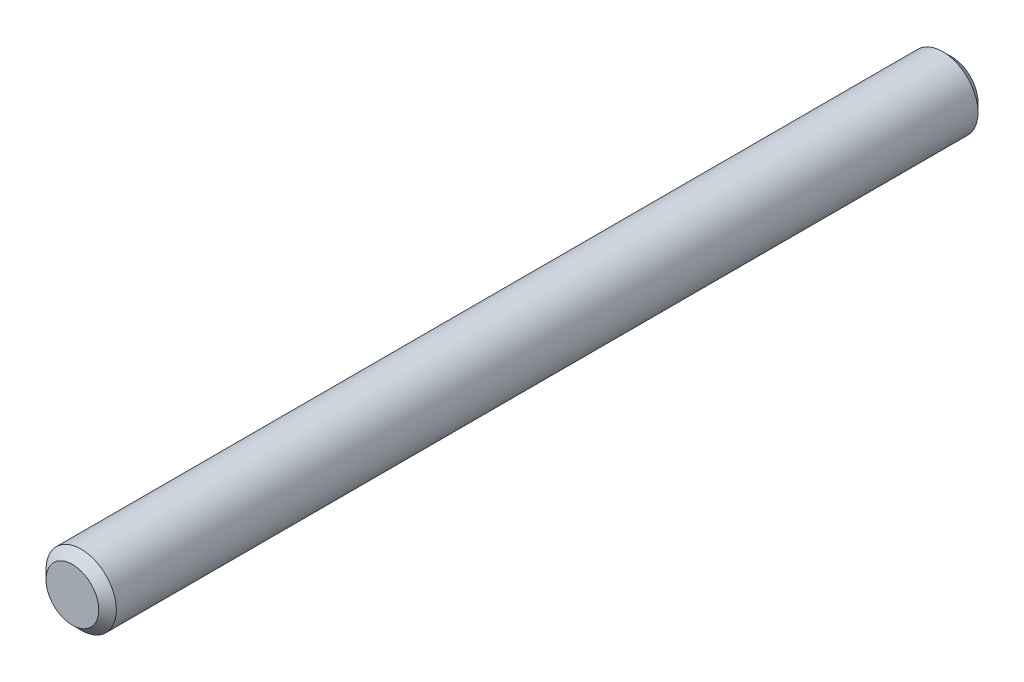
ISO-10303-21;
HEADER;
FILE_DESCRIPTION(('STEP AP214'),'2;1');
FILE_NAME('part.step','',(''),(''),'','','');
FILE_SCHEMA(('AUTOMOTIVE_DESIGN { 1 0 10303 214 1 1 1 1 }'));
ENDSEC;
DATA;
#1=APPLICATION_CONTEXT('core data for automotive mechanical design processes');
#2=APPLICATION_PROTOCOL_DEFINITION('international standard','automotive_design',2000,#1);
#3=PRODUCT_CONTEXT('',#1,'mechanical');
#4=PRODUCT('Part','Part','',(#3));
#5=PRODUCT_RELATED_PRODUCT_CATEGORY('part','',(#4));
#6=PRODUCT_DEFINITION_FORMATION('','',#4);
#7=PRODUCT_DEFINITION_CONTEXT('part definition',#1,'design');
#8=PRODUCT_DEFINITION('design','',#6,#7);
#9=PRODUCT_DEFINITION_SHAPE('','',#8);
#10=(LENGTH_UNIT() NAMED_UNIT(*) SI_UNIT(.MILLI.,.METRE.));
#11=(NAMED_UNIT(*) PLANE_ANGLE_UNIT() SI_UNIT($,.RADIAN.));
#12=(NAMED_UNIT(*) SI_UNIT($,.STERADIAN.) SOLID_ANGLE_UNIT());
#13=UNCERTAINTY_MEASURE_WITH_UNIT(LENGTH_MEASURE(1.E-05),#10,'distance_accuracy_value','');
#14=(GEOMETRIC_REPRESENTATION_CONTEXT(3) GLOBAL_UNCERTAINTY_ASSIGNED_CONTEXT((#13)) GLOBAL_UNIT_ASSIGNED_CONTEXT((#10,
#11,#12)) REPRESENTATION_CONTEXT('',''));
#15=CARTESIAN_POINT('',(0.,0.,0.));
#16=DIRECTION('',(0.,0.,1.));
#17=DIRECTION('',(1.,0.,0.));
#18=AXIS2_PLACEMENT_3D('',#15,#16,#17);
#19=CARTESIAN_POINT('',(0.,0.,100.));
#20=DIRECTION('',(0.,0.,-1.));
#21=DIRECTION('',(-1.,0.,0.));
#22=AXIS2_PLACEMENT_3D('',#19,#20,#21);
#23=CYLINDRICAL_SURFACE('',#22,4.);
#24=CARTESIAN_POINT('',(0.,0.,99.));
#25=DIRECTION('',(0.,0.,1.));
#26=DIRECTION('',(1.,0.,0.));
#27=AXIS2_PLACEMENT_3D('',#24,#25,#26);
#28=CIRCLE('',#27,4.);
#29=CARTESIAN_POINT('',(4.,0.,99.));
#30=VERTEX_POINT('',#29);
#31=EDGE_CURVE('E37',#30,#30,#28,.F.);
#32=ORIENTED_EDGE('',*,*,#31,.T.);
#33=EDGE_LOOP('',(#32));
#34=FACE_BOUND('',#33,.T.);
#35=CARTESIAN_POINT('',(0.,0.,0.999999999999987));
#36=DIRECTION('',(0.,0.,1.));
#37=DIRECTION('',(1.,0.,0.));
#38=AXIS2_PLACEMENT_3D('',#35,#36,#37);
#39=CIRCLE('',#38,4.);
#40=CARTESIAN_POINT('',(4.,0.,0.999999999999987));
#41=VERTEX_POINT('',#40);
#42=EDGE_CURVE('E41',#41,#41,#39,.T.);
#43=ORIENTED_EDGE('',*,*,#42,.T.);
#44=EDGE_LOOP('',(#43));
#45=FACE_BOUND('',#44,.T.);
#46=ADVANCED_FACE('F30',(#34,#45),#23,.T.);
#47=CARTESIAN_POINT('',(0.,0.,100.));
#48=DIRECTION('',(0.,0.,1.));
#49=DIRECTION('',(1.,0.,0.));
#50=AXIS2_PLACEMENT_3D('',#47,#48,#49);
#51=PLANE('',#50);
#52=CARTESIAN_POINT('',(0.,0.,100.));
#53=DIRECTION('',(0.,0.,1.));
#54=DIRECTION('',(1.,0.,0.));
#55=AXIS2_PLACEMENT_3D('',#52,#53,#54);
#56=CIRCLE('',#55,3.00000000000002);
#57=CARTESIAN_POINT('',(3.00000000000002,0.,100.));
#58=VERTEX_POINT('',#57);
#59=EDGE_CURVE('E45',#58,#58,#56,.T.);
#60=ORIENTED_EDGE('',*,*,#59,.T.);
#61=EDGE_LOOP('',(#60));
#62=FACE_BOUND('',#61,.T.);
#63=ADVANCED_FACE('F51',(#62),#51,.T.);
#64=CARTESIAN_POINT('',(0.,0.,0.));
#65=DIRECTION('',(0.,0.,1.));
#66=DIRECTION('',(1.,0.,0.));
#67=AXIS2_PLACEMENT_3D('',#64,#65,#66);
#68=PLANE('',#67);
#69=CARTESIAN_POINT('',(0.,0.,0.));
#70=DIRECTION('',(0.,0.,1.));
#71=DIRECTION('',(1.,0.,0.));
#72=AXIS2_PLACEMENT_3D('',#69,#70,#71);
#73=CIRCLE('',#72,3.00000000000002);
#74=CARTESIAN_POINT('',(3.00000000000002,0.,0.));
#75=VERTEX_POINT('',#74);
#76=EDGE_CURVE('E10',#75,#75,#73,.F.);
#77=ORIENTED_EDGE('',*,*,#76,.T.);
#78=EDGE_LOOP('',(#77));
#79=FACE_BOUND('',#78,.T.);
#80=ADVANCED_FACE('F55',(#79),#68,.F.);
#81=CARTESIAN_POINT('',(0.,0.,100.));
#82=DIRECTION('',(0.,0.,-1.));
#83=DIRECTION('',(-1.,0.,0.));
#84=AXIS2_PLACEMENT_3D('',#81,#82,#83);
#85=CONICAL_SURFACE('',#84,3.00000000000002,0.78539816339744);
#86=ORIENTED_EDGE('',*,*,#31,.F.);
#87=EDGE_LOOP('',(#86));
#88=FACE_BOUND('',#87,.T.);
#89=ORIENTED_EDGE('',*,*,#59,.F.);
#90=EDGE_LOOP('',(#89));
#91=FACE_BOUND('',#90,.T.);
#92=ADVANCED_FACE('F53',(#88,#91),#85,.T.);
#93=CARTESIAN_POINT('',(0.,0.,0.999999999999987));
#94=DIRECTION('',(0.,0.,1.));
#95=DIRECTION('',(1.,0.,0.));
#96=AXIS2_PLACEMENT_3D('',#93,#94,#95);
#97=CONICAL_SURFACE('',#96,4.,0.785398163397447);
#98=ORIENTED_EDGE('',*,*,#76,.F.);
#99=EDGE_LOOP('',(#98));
#100=FACE_BOUND('',#99,.T.);
#101=ORIENTED_EDGE('',*,*,#42,.F.);
#102=EDGE_LOOP('',(#101));
#103=FACE_BOUND('',#102,.T.);
#104=ADVANCED_FACE('F32',(#100,#103),#97,.T.);
#105=CLOSED_SHELL('',(#46,#63,#80,#92,#104));
#106=MANIFOLD_SOLID_BREP('B2',#105);
#107=ADVANCED_BREP_SHAPE_REPRESENTATION('',(#18,#106),#14);
#108=SHAPE_DEFINITION_REPRESENTATION(#9,#107);
ENDSEC;
END-ISO-10303-21;
